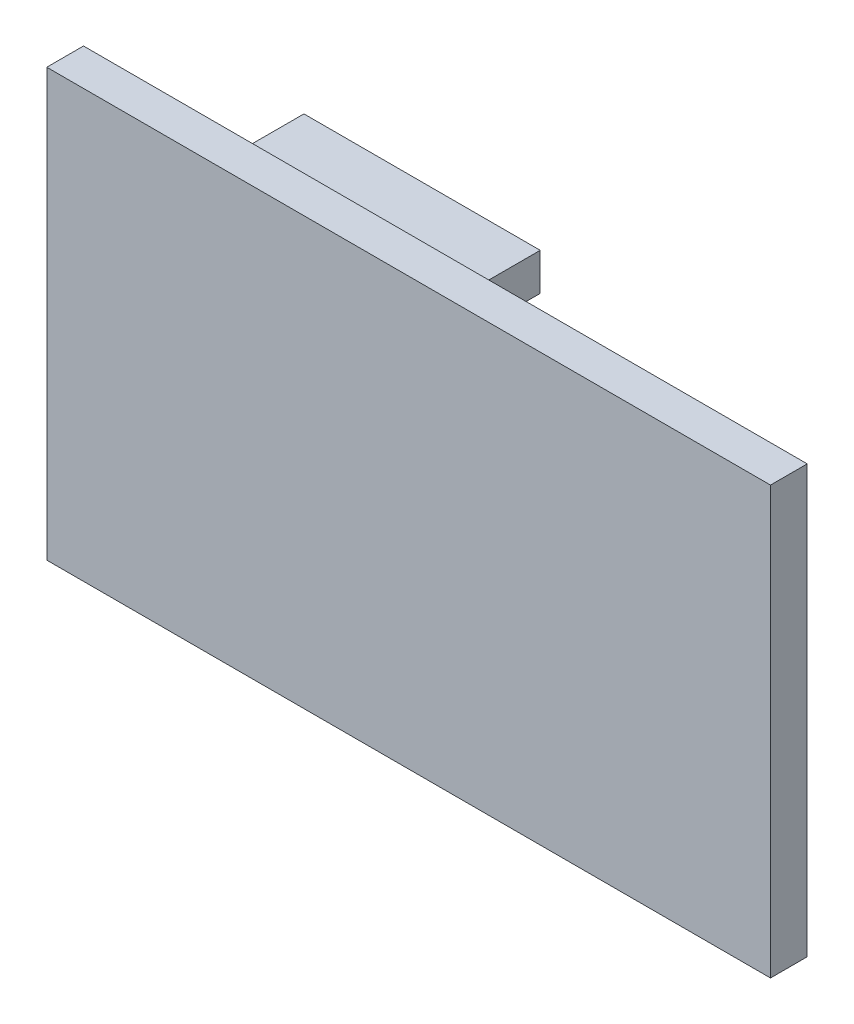
ISO-10303-21;
HEADER;
FILE_DESCRIPTION(('STEP AP214'),'2;1');
FILE_NAME('part.step','',(''),(''),'','','');
FILE_SCHEMA(('AUTOMOTIVE_DESIGN { 1 0 10303 214 1 1 1 1 }'));
ENDSEC;
DATA;
#1=APPLICATION_CONTEXT('core data for automotive mechanical design processes');
#2=APPLICATION_PROTOCOL_DEFINITION('international standard','automotive_design',2000,#1);
#3=PRODUCT_CONTEXT('',#1,'mechanical');
#4=PRODUCT('Part','Part','',(#3));
#5=PRODUCT_RELATED_PRODUCT_CATEGORY('part','',(#4));
#6=PRODUCT_DEFINITION_FORMATION('','',#4);
#7=PRODUCT_DEFINITION_CONTEXT('part definition',#1,'design');
#8=PRODUCT_DEFINITION('design','',#6,#7);
#9=PRODUCT_DEFINITION_SHAPE('','',#8);
#10=(LENGTH_UNIT() NAMED_UNIT(*) SI_UNIT(.MILLI.,.METRE.));
#11=(NAMED_UNIT(*) PLANE_ANGLE_UNIT() SI_UNIT($,.RADIAN.));
#12=(NAMED_UNIT(*) SI_UNIT($,.STERADIAN.) SOLID_ANGLE_UNIT());
#13=UNCERTAINTY_MEASURE_WITH_UNIT(LENGTH_MEASURE(1.E-05),#10,'distance_accuracy_value','');
#14=(GEOMETRIC_REPRESENTATION_CONTEXT(3) GLOBAL_UNCERTAINTY_ASSIGNED_CONTEXT((#13)) GLOBAL_UNIT_ASSIGNED_CONTEXT((#10,
#11,#12)) REPRESENTATION_CONTEXT('',''));
#15=CARTESIAN_POINT('',(0.,0.,0.));
#16=DIRECTION('',(0.,0.,1.));
#17=DIRECTION('',(1.,0.,0.));
#18=AXIS2_PLACEMENT_3D('',#15,#16,#17);
#19=CARTESIAN_POINT('',(0.,0.,0.));
#20=DIRECTION('',(0.,0.,1.));
#21=DIRECTION('',(1.,0.,0.));
#22=AXIS2_PLACEMENT_3D('',#19,#20,#21);
#23=PLANE('',#22);
#24=DIRECTION('',(0.,1.,0.));
#25=VECTOR('',#24,1.);
#26=CARTESIAN_POINT('',(49.25,29.05,0.));
#27=LINE('',#26,#25);
#28=CARTESIAN_POINT('',(49.25,-29.05,0.));
#29=VERTEX_POINT('',#28);
#30=CARTESIAN_POINT('',(49.25,29.05,0.));
#31=VERTEX_POINT('',#30);
#32=EDGE_CURVE('E141',#29,#31,#27,.T.);
#33=ORIENTED_EDGE('',*,*,#32,.F.);
#34=DIRECTION('',(1.,0.,0.));
#35=VECTOR('',#34,1.);
#36=CARTESIAN_POINT('',(-49.25,-29.05,0.));
#37=LINE('',#36,#35);
#38=CARTESIAN_POINT('',(-49.25,-29.05,0.));
#39=VERTEX_POINT('',#38);
#40=EDGE_CURVE('E157',#39,#29,#37,.T.);
#41=ORIENTED_EDGE('',*,*,#40,.F.);
#42=DIRECTION('',(0.,-1.,0.));
#43=VECTOR('',#42,1.);
#44=CARTESIAN_POINT('',(-49.25,29.05,0.));
#45=LINE('',#44,#43);
#46=CARTESIAN_POINT('',(-49.25,29.05,0.));
#47=VERTEX_POINT('',#46);
#48=EDGE_CURVE('E169',#47,#39,#45,.T.);
#49=ORIENTED_EDGE('',*,*,#48,.F.);
#50=DIRECTION('',(-1.,0.,0.));
#51=VECTOR('',#50,1.);
#52=CARTESIAN_POINT('',(-49.25,29.05,0.));
#53=LINE('',#52,#51);
#54=EDGE_CURVE('E146',#31,#47,#53,.T.);
#55=ORIENTED_EDGE('',*,*,#54,.F.);
#56=EDGE_LOOP('',(#33,#41,#49,#55));
#57=FACE_BOUND('',#56,.T.);
#58=DIRECTION('',(0.,-1.,0.));
#59=VECTOR('',#58,1.);
#60=CARTESIAN_POINT('',(2.91,26.05,0.));
#61=LINE('',#60,#59);
#62=CARTESIAN_POINT('',(2.91,26.05,0.));
#63=VERTEX_POINT('',#62);
#64=CARTESIAN_POINT('',(2.91,20.97,0.));
#65=VERTEX_POINT('',#64);
#66=EDGE_CURVE('E139',#63,#65,#61,.T.);
#67=ORIENTED_EDGE('',*,*,#66,.F.);
#68=DIRECTION('',(1.,0.,0.));
#69=VECTOR('',#68,1.);
#70=CARTESIAN_POINT('',(2.91,26.05,0.));
#71=LINE('',#70,#69);
#72=CARTESIAN_POINT('',(-29.25,26.05,0.));
#73=VERTEX_POINT('',#72);
#74=EDGE_CURVE('E136',#73,#63,#71,.T.);
#75=ORIENTED_EDGE('',*,*,#74,.F.);
#76=DIRECTION('',(0.,1.,0.));
#77=VECTOR('',#76,1.);
#78=CARTESIAN_POINT('',(-29.25,26.05,0.));
#79=LINE('',#78,#77);
#80=CARTESIAN_POINT('',(-29.25,20.97,0.));
#81=VERTEX_POINT('',#80);
#82=EDGE_CURVE('E72',#81,#73,#79,.T.);
#83=ORIENTED_EDGE('',*,*,#82,.F.);
#84=DIRECTION('',(-1.,0.,0.));
#85=VECTOR('',#84,1.);
#86=CARTESIAN_POINT('',(2.91,20.97,0.));
#87=LINE('',#86,#85);
#88=EDGE_CURVE('E67',#65,#81,#87,.T.);
#89=ORIENTED_EDGE('',*,*,#88,.F.);
#90=EDGE_LOOP('',(#67,#75,#83,#89));
#91=FACE_BOUND('',#90,.T.);
#92=ADVANCED_FACE('F51',(#57,#91),#23,.F.);
#93=CARTESIAN_POINT('',(49.25,29.05,5.));
#94=DIRECTION('',(-1.,0.,0.));
#95=DIRECTION('',(0.,0.,1.));
#96=AXIS2_PLACEMENT_3D('',#93,#94,#95);
#97=PLANE('',#96);
#98=ORIENTED_EDGE('',*,*,#32,.T.);
#99=DIRECTION('',(0.,0.,-1.));
#100=VECTOR('',#99,1.);
#101=CARTESIAN_POINT('',(49.25,29.05,5.));
#102=LINE('',#101,#100);
#103=CARTESIAN_POINT('',(49.25,29.05,5.));
#104=VERTEX_POINT('',#103);
#105=EDGE_CURVE('E11',#104,#31,#102,.T.);
#106=ORIENTED_EDGE('',*,*,#105,.F.);
#107=DIRECTION('',(0.,1.,0.));
#108=VECTOR('',#107,1.);
#109=CARTESIAN_POINT('',(49.25,29.05,5.));
#110=LINE('',#109,#108);
#111=CARTESIAN_POINT('',(49.25,-29.05,5.));
#112=VERTEX_POINT('',#111);
#113=EDGE_CURVE('E152',#112,#104,#110,.T.);
#114=ORIENTED_EDGE('',*,*,#113,.F.);
#115=DIRECTION('',(0.,0.,-1.));
#116=VECTOR('',#115,1.);
#117=CARTESIAN_POINT('',(49.25,-29.05,5.));
#118=LINE('',#117,#116);
#119=EDGE_CURVE('E165',#112,#29,#118,.T.);
#120=ORIENTED_EDGE('',*,*,#119,.T.);
#121=EDGE_LOOP('',(#98,#106,#114,#120));
#122=FACE_BOUND('',#121,.T.);
#123=ADVANCED_FACE('F53',(#122),#97,.F.);
#124=CARTESIAN_POINT('',(-49.25,29.05,5.));
#125=DIRECTION('',(0.,-1.,0.));
#126=DIRECTION('',(0.,0.,-1.));
#127=AXIS2_PLACEMENT_3D('',#124,#125,#126);
#128=PLANE('',#127);
#129=ORIENTED_EDGE('',*,*,#54,.T.);
#130=DIRECTION('',(0.,0.,-1.));
#131=VECTOR('',#130,1.);
#132=CARTESIAN_POINT('',(-49.25,29.05,5.));
#133=LINE('',#132,#131);
#134=CARTESIAN_POINT('',(-49.25,29.05,5.));
#135=VERTEX_POINT('',#134);
#136=EDGE_CURVE('E60',#135,#47,#133,.T.);
#137=ORIENTED_EDGE('',*,*,#136,.F.);
#138=DIRECTION('',(-1.,0.,0.));
#139=VECTOR('',#138,1.);
#140=CARTESIAN_POINT('',(-49.25,29.05,5.));
#141=LINE('',#140,#139);
#142=EDGE_CURVE('E156',#104,#135,#141,.T.);
#143=ORIENTED_EDGE('',*,*,#142,.F.);
#144=ORIENTED_EDGE('',*,*,#105,.T.);
#145=EDGE_LOOP('',(#129,#137,#143,#144));
#146=FACE_BOUND('',#145,.T.);
#147=ADVANCED_FACE('F201',(#146),#128,.F.);
#148=CARTESIAN_POINT('',(-49.25,29.05,5.));
#149=DIRECTION('',(1.,0.,0.));
#150=DIRECTION('',(0.,1.,0.));
#151=AXIS2_PLACEMENT_3D('',#148,#149,#150);
#152=PLANE('',#151);
#153=ORIENTED_EDGE('',*,*,#48,.T.);
#154=DIRECTION('',(0.,0.,-1.));
#155=VECTOR('',#154,1.);
#156=CARTESIAN_POINT('',(-49.25,-29.05,5.));
#157=LINE('',#156,#155);
#158=CARTESIAN_POINT('',(-49.25,-29.05,5.));
#159=VERTEX_POINT('',#158);
#160=EDGE_CURVE('E177',#159,#39,#157,.T.);
#161=ORIENTED_EDGE('',*,*,#160,.F.);
#162=DIRECTION('',(0.,-1.,0.));
#163=VECTOR('',#162,1.);
#164=CARTESIAN_POINT('',(-49.25,29.05,5.));
#165=LINE('',#164,#163);
#166=EDGE_CURVE('E160',#135,#159,#165,.T.);
#167=ORIENTED_EDGE('',*,*,#166,.F.);
#168=ORIENTED_EDGE('',*,*,#136,.T.);
#169=EDGE_LOOP('',(#153,#161,#167,#168));
#170=FACE_BOUND('',#169,.T.);
#171=ADVANCED_FACE('F186',(#170),#152,.F.);
#172=CARTESIAN_POINT('',(-49.25,-29.05,5.));
#173=DIRECTION('',(0.,1.,0.));
#174=DIRECTION('',(0.,0.,1.));
#175=AXIS2_PLACEMENT_3D('',#172,#173,#174);
#176=PLANE('',#175);
#177=ORIENTED_EDGE('',*,*,#40,.T.);
#178=ORIENTED_EDGE('',*,*,#119,.F.);
#179=DIRECTION('',(1.,0.,0.));
#180=VECTOR('',#179,1.);
#181=CARTESIAN_POINT('',(-49.25,-29.05,5.));
#182=LINE('',#181,#180);
#183=EDGE_CURVE('E163',#159,#112,#182,.T.);
#184=ORIENTED_EDGE('',*,*,#183,.F.);
#185=ORIENTED_EDGE('',*,*,#160,.T.);
#186=EDGE_LOOP('',(#177,#178,#184,#185));
#187=FACE_BOUND('',#186,.T.);
#188=ADVANCED_FACE('F194',(#187),#176,.F.);
#189=CARTESIAN_POINT('',(0.,0.,5.));
#190=DIRECTION('',(0.,0.,1.));
#191=DIRECTION('',(1.,0.,0.));
#192=AXIS2_PLACEMENT_3D('',#189,#190,#191);
#193=PLANE('',#192);
#194=ORIENTED_EDGE('',*,*,#113,.T.);
#195=ORIENTED_EDGE('',*,*,#142,.T.);
#196=ORIENTED_EDGE('',*,*,#166,.T.);
#197=ORIENTED_EDGE('',*,*,#183,.T.);
#198=EDGE_LOOP('',(#194,#195,#196,#197));
#199=FACE_BOUND('',#198,.T.);
#200=ADVANCED_FACE('F200',(#199),#193,.T.);
#201=CARTESIAN_POINT('',(2.91,26.05,-10.));
#202=DIRECTION('',(-1.,0.,0.));
#203=DIRECTION('',(0.,-1.,0.));
#204=AXIS2_PLACEMENT_3D('',#201,#202,#203);
#205=PLANE('',#204);
#206=ORIENTED_EDGE('',*,*,#66,.T.);
#207=DIRECTION('',(0.,0.,1.));
#208=VECTOR('',#207,1.);
#209=CARTESIAN_POINT('',(2.91,20.97,-10.));
#210=LINE('',#209,#208);
#211=CARTESIAN_POINT('',(2.91,20.97,-10.));
#212=VERTEX_POINT('',#211);
#213=EDGE_CURVE('E118',#212,#65,#210,.T.);
#214=ORIENTED_EDGE('',*,*,#213,.F.);
#215=DIRECTION('',(0.,-1.,0.));
#216=VECTOR('',#215,1.);
#217=CARTESIAN_POINT('',(2.91,26.05,-10.));
#218=LINE('',#217,#216);
#219=CARTESIAN_POINT('',(2.91,26.05,-10.));
#220=VERTEX_POINT('',#219);
#221=EDGE_CURVE('E126',#220,#212,#218,.T.);
#222=ORIENTED_EDGE('',*,*,#221,.F.);
#223=DIRECTION('',(0.,0.,1.));
#224=VECTOR('',#223,1.);
#225=CARTESIAN_POINT('',(2.91,26.05,-10.));
#226=LINE('',#225,#224);
#227=EDGE_CURVE('E324',#220,#63,#226,.T.);
#228=ORIENTED_EDGE('',*,*,#227,.T.);
#229=EDGE_LOOP('',(#206,#214,#222,#228));
#230=FACE_BOUND('',#229,.T.);
#231=ADVANCED_FACE('F138',(#230),#205,.F.);
#232=CARTESIAN_POINT('',(2.91,20.97,-10.));
#233=DIRECTION('',(0.,1.,0.));
#234=DIRECTION('',(0.,0.,1.));
#235=AXIS2_PLACEMENT_3D('',#232,#233,#234);
#236=PLANE('',#235);
#237=ORIENTED_EDGE('',*,*,#88,.T.);
#238=DIRECTION('',(0.,0.,1.));
#239=VECTOR('',#238,1.);
#240=CARTESIAN_POINT('',(-29.25,20.97,-10.));
#241=LINE('',#240,#239);
#242=CARTESIAN_POINT('',(-29.25,20.97,-10.));
#243=VERTEX_POINT('',#242);
#244=EDGE_CURVE('E121',#243,#81,#241,.T.);
#245=ORIENTED_EDGE('',*,*,#244,.F.);
#246=DIRECTION('',(-1.,0.,0.));
#247=VECTOR('',#246,1.);
#248=CARTESIAN_POINT('',(2.91,20.97,-10.));
#249=LINE('',#248,#247);
#250=EDGE_CURVE('E114',#212,#243,#249,.T.);
#251=ORIENTED_EDGE('',*,*,#250,.F.);
#252=ORIENTED_EDGE('',*,*,#213,.T.);
#253=EDGE_LOOP('',(#237,#245,#251,#252));
#254=FACE_BOUND('',#253,.T.);
#255=ADVANCED_FACE('F116',(#254),#236,.F.);
#256=CARTESIAN_POINT('',(-29.25,26.05,-10.));
#257=DIRECTION('',(1.,0.,0.));
#258=DIRECTION('',(0.,1.,0.));
#259=AXIS2_PLACEMENT_3D('',#256,#257,#258);
#260=PLANE('',#259);
#261=ORIENTED_EDGE('',*,*,#82,.T.);
#262=DIRECTION('',(0.,0.,1.));
#263=VECTOR('',#262,1.);
#264=CARTESIAN_POINT('',(-29.25,26.05,-10.));
#265=LINE('',#264,#263);
#266=CARTESIAN_POINT('',(-29.25,26.05,-10.));
#267=VERTEX_POINT('',#266);
#268=EDGE_CURVE('E148',#267,#73,#265,.T.);
#269=ORIENTED_EDGE('',*,*,#268,.F.);
#270=DIRECTION('',(0.,1.,0.));
#271=VECTOR('',#270,1.);
#272=CARTESIAN_POINT('',(-29.25,26.05,-10.));
#273=LINE('',#272,#271);
#274=EDGE_CURVE('E125',#243,#267,#273,.T.);
#275=ORIENTED_EDGE('',*,*,#274,.F.);
#276=ORIENTED_EDGE('',*,*,#244,.T.);
#277=EDGE_LOOP('',(#261,#269,#275,#276));
#278=FACE_BOUND('',#277,.T.);
#279=ADVANCED_FACE('F226',(#278),#260,.F.);
#280=CARTESIAN_POINT('',(2.91,26.05,-10.));
#281=DIRECTION('',(0.,-1.,0.));
#282=DIRECTION('',(0.,0.,-1.));
#283=AXIS2_PLACEMENT_3D('',#280,#281,#282);
#284=PLANE('',#283);
#285=ORIENTED_EDGE('',*,*,#74,.T.);
#286=ORIENTED_EDGE('',*,*,#227,.F.);
#287=DIRECTION('',(1.,0.,0.));
#288=VECTOR('',#287,1.);
#289=CARTESIAN_POINT('',(2.91,26.05,-10.));
#290=LINE('',#289,#288);
#291=EDGE_CURVE('E131',#267,#220,#290,.T.);
#292=ORIENTED_EDGE('',*,*,#291,.F.);
#293=ORIENTED_EDGE('',*,*,#268,.T.);
#294=EDGE_LOOP('',(#285,#286,#292,#293));
#295=FACE_BOUND('',#294,.T.);
#296=ADVANCED_FACE('F231',(#295),#284,.F.);
#297=CARTESIAN_POINT('',(0.,0.,-10.));
#298=DIRECTION('',(0.,0.,-1.));
#299=DIRECTION('',(-1.,0.,0.));
#300=AXIS2_PLACEMENT_3D('',#297,#298,#299);
#301=PLANE('',#300);
#302=ORIENTED_EDGE('',*,*,#221,.T.);
#303=ORIENTED_EDGE('',*,*,#250,.T.);
#304=ORIENTED_EDGE('',*,*,#274,.T.);
#305=ORIENTED_EDGE('',*,*,#291,.T.);
#306=EDGE_LOOP('',(#302,#303,#304,#305));
#307=FACE_BOUND('',#306,.T.);
#308=ADVANCED_FACE('F129',(#307),#301,.T.);
#309=CLOSED_SHELL('',(#92,#123,#147,#171,#188,#200,#231,#255,#279,#296,#308));
#310=MANIFOLD_SOLID_BREP('B2',#309);
#311=ADVANCED_BREP_SHAPE_REPRESENTATION('',(#18,#310),#14);
#312=SHAPE_DEFINITION_REPRESENTATION(#9,#311);
ENDSEC;
END-ISO-10303-21;
